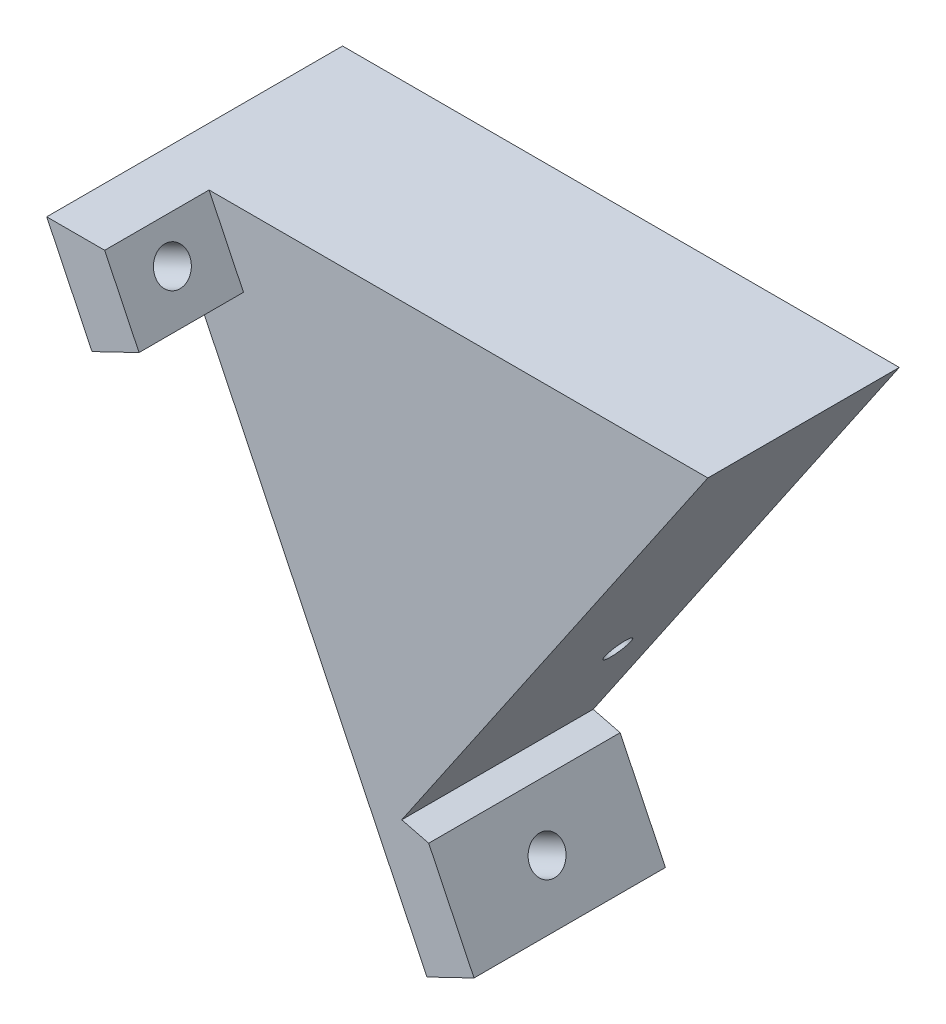
ISO-10303-21;
HEADER;
FILE_DESCRIPTION(('STEP AP214'),'2;1');
FILE_NAME('part.step','',(''),(''),'','','');
FILE_SCHEMA(('AUTOMOTIVE_DESIGN { 1 0 10303 214 1 1 1 1 }'));
ENDSEC;
DATA;
#1=APPLICATION_CONTEXT('core data for automotive mechanical design processes');
#2=APPLICATION_PROTOCOL_DEFINITION('international standard','automotive_design',2000,#1);
#3=PRODUCT_CONTEXT('',#1,'mechanical');
#4=PRODUCT('Part','Part','',(#3));
#5=PRODUCT_RELATED_PRODUCT_CATEGORY('part','',(#4));
#6=PRODUCT_DEFINITION_FORMATION('','',#4);
#7=PRODUCT_DEFINITION_CONTEXT('part definition',#1,'design');
#8=PRODUCT_DEFINITION('design','',#6,#7);
#9=PRODUCT_DEFINITION_SHAPE('','',#8);
#10=(LENGTH_UNIT() NAMED_UNIT(*) SI_UNIT(.MILLI.,.METRE.));
#11=(NAMED_UNIT(*) PLANE_ANGLE_UNIT() SI_UNIT($,.RADIAN.));
#12=(NAMED_UNIT(*) SI_UNIT($,.STERADIAN.) SOLID_ANGLE_UNIT());
#13=UNCERTAINTY_MEASURE_WITH_UNIT(LENGTH_MEASURE(1.E-05),#10,'distance_accuracy_value','');
#14=(GEOMETRIC_REPRESENTATION_CONTEXT(3) GLOBAL_UNCERTAINTY_ASSIGNED_CONTEXT((#13)) GLOBAL_UNIT_ASSIGNED_CONTEXT((#10,
#11,#12)) REPRESENTATION_CONTEXT('',''));
#15=CARTESIAN_POINT('',(0.,0.,0.));
#16=DIRECTION('',(0.,0.,1.));
#17=DIRECTION('',(1.,0.,0.));
#18=AXIS2_PLACEMENT_3D('',#15,#16,#17);
#19=CARTESIAN_POINT('',(0.,0.,22.));
#20=DIRECTION('',(0.,0.,1.));
#21=DIRECTION('',(1.,0.,0.));
#22=AXIS2_PLACEMENT_3D('',#19,#20,#21);
#23=PLANE('',#22);
#24=DIRECTION('',(-1.,0.,0.));
#25=VECTOR('',#24,1.);
#26=CARTESIAN_POINT('',(27.7445797660574,24.241346542851,22.));
#27=LINE('',#26,#25);
#28=CARTESIAN_POINT('',(27.7445797660574,24.241346542851,22.));
#29=VERTEX_POINT('',#28);
#30=CARTESIAN_POINT('',(-29.578701160511,24.241346542851,22.));
#31=VERTEX_POINT('',#30);
#32=EDGE_CURVE('E111',#29,#31,#27,.T.);
#33=ORIENTED_EDGE('',*,*,#32,.T.);
#34=DIRECTION('',(0.434007039127834,-0.900909479352665,0.));
#35=VECTOR('',#34,1.);
#36=CARTESIAN_POINT('',(-30.8331808679364,26.8453887776181,22.));
#37=LINE('',#36,#35);
#38=CARTESIAN_POINT('',(-25.6250963984024,16.0344750253861,22.));
#39=VERTEX_POINT('',#38);
#40=EDGE_CURVE('E117',#31,#39,#37,.T.);
#41=ORIENTED_EDGE('',*,*,#40,.T.);
#42=DIRECTION('',(-0.900909479352665,-0.434007039127834,0.));
#43=VECTOR('',#42,1.);
#44=CARTESIAN_POINT('',(-25.6250963984024,16.0344750253861,22.));
#45=LINE('',#44,#43);
#46=CARTESIAN_POINT('',(-31.0305532745184,13.4304327906191,22.));
#47=VERTEX_POINT('',#46);
#48=EDGE_CURVE('E137',#39,#47,#45,.T.);
#49=ORIENTED_EDGE('',*,*,#48,.T.);
#50=DIRECTION('',(0.434007039127834,-0.900909479352665,0.));
#51=VECTOR('',#50,1.);
#52=CARTESIAN_POINT('',(-36.2386377440524,24.241346542851,22.));
#53=LINE('',#52,#51);
#54=CARTESIAN_POINT('',(-4.53467583166741,-41.5695672093809,22.));
#55=VERTEX_POINT('',#54);
#56=EDGE_CURVE('E130',#47,#55,#53,.T.);
#57=ORIENTED_EDGE('',*,*,#56,.T.);
#58=DIRECTION('',(-0.900909479352665,-0.434007039127834,0.));
#59=VECTOR('',#58,1.);
#60=CARTESIAN_POINT('',(0.870781044448587,-38.9655249746139,22.));
#61=LINE('',#60,#59);
#62=CARTESIAN_POINT('',(0.870781044448587,-38.9655249746139,22.));
#63=VERTEX_POINT('',#62);
#64=EDGE_CURVE('E187',#63,#55,#61,.T.);
#65=ORIENTED_EDGE('',*,*,#64,.F.);
#66=DIRECTION('',(-0.434007039127834,0.900909479352665,0.));
#67=VECTOR('',#66,1.);
#68=CARTESIAN_POINT('',(-4.33730342508542,-28.154611222382,22.));
#69=LINE('',#68,#67);
#70=CARTESIAN_POINT('',(-4.33730342508542,-28.154611222382,22.));
#71=VERTEX_POINT('',#70);
#72=EDGE_CURVE('E181',#63,#71,#69,.T.);
#73=ORIENTED_EDGE('',*,*,#72,.T.);
#74=DIRECTION('',(0.969773253525637,-0.24400786205838,0.));
#75=VECTOR('',#74,1.);
#76=CARTESIAN_POINT('',(-4.33730342508542,-28.154611222382,22.));
#77=LINE('',#76,#75);
#78=CARTESIAN_POINT('',(-7.43639298756733,-27.3748390274699,22.));
#79=VERTEX_POINT('',#78);
#80=EDGE_CURVE('E193',#79,#71,#77,.T.);
#81=ORIENTED_EDGE('',*,*,#80,.F.);
#82=DIRECTION('',(0.563206976065699,0.826315860982307,0.));
#83=VECTOR('',#82,1.);
#84=CARTESIAN_POINT('',(-9.74276030120141,-30.758653457149,22.));
#85=LINE('',#84,#83);
#86=EDGE_CURVE('E128',#79,#29,#85,.T.);
#87=ORIENTED_EDGE('',*,*,#86,.T.);
#88=EDGE_LOOP('',(#33,#41,#49,#57,#65,#73,#81,#87));
#89=FACE_BOUND('',#88,.T.);
#90=ADVANCED_FACE('F33',(#89),#23,.T.);
#91=CARTESIAN_POINT('',(27.7445797660574,24.241346542851,22.));
#92=DIRECTION('',(0.,-1.,0.));
#93=DIRECTION('',(0.,0.,-1.));
#94=AXIS2_PLACEMENT_3D('',#91,#92,#93);
#95=PLANE('',#94);
#96=DIRECTION('',(-1.,0.,0.));
#97=VECTOR('',#96,1.);
#98=CARTESIAN_POINT('',(27.7445797660574,24.241346542851,0.));
#99=LINE('',#98,#97);
#100=CARTESIAN_POINT('',(27.7445797660574,24.241346542851,0.));
#101=VERTEX_POINT('',#100);
#102=CARTESIAN_POINT('',(-36.2386377440524,24.241346542851,0.));
#103=VERTEX_POINT('',#102);
#104=EDGE_CURVE('E142',#101,#103,#99,.T.);
#105=ORIENTED_EDGE('',*,*,#104,.T.);
#106=DIRECTION('',(0.,0.,-1.));
#107=VECTOR('',#106,1.);
#108=CARTESIAN_POINT('',(-36.2386377440524,24.241346542851,22.));
#109=LINE('',#108,#107);
#110=CARTESIAN_POINT('',(-36.2386377440524,24.241346542851,34.));
#111=VERTEX_POINT('',#110);
#112=EDGE_CURVE('E124',#111,#103,#109,.T.);
#113=ORIENTED_EDGE('',*,*,#112,.F.);
#114=DIRECTION('',(1.,0.,0.));
#115=VECTOR('',#114,1.);
#116=CARTESIAN_POINT('',(-30.8331808679364,24.241346542851,34.));
#117=LINE('',#116,#115);
#118=CARTESIAN_POINT('',(-29.578701160511,24.241346542851,34.));
#119=VERTEX_POINT('',#118);
#120=EDGE_CURVE('E47',#111,#119,#117,.T.);
#121=ORIENTED_EDGE('',*,*,#120,.T.);
#122=DIRECTION('',(0.,0.,-1.));
#123=VECTOR('',#122,1.);
#124=CARTESIAN_POINT('',(-29.578701160511,24.241346542851,0.));
#125=LINE('',#124,#123);
#126=EDGE_CURVE('E11',#119,#31,#125,.T.);
#127=ORIENTED_EDGE('',*,*,#126,.T.);
#128=ORIENTED_EDGE('',*,*,#32,.F.);
#129=DIRECTION('',(0.,0.,-1.));
#130=VECTOR('',#129,1.);
#131=CARTESIAN_POINT('',(27.7445797660574,24.241346542851,22.));
#132=LINE('',#131,#130);
#133=EDGE_CURVE('E141',#29,#101,#132,.T.);
#134=ORIENTED_EDGE('',*,*,#133,.T.);
#135=EDGE_LOOP('',(#105,#113,#121,#127,#128,#134));
#136=FACE_BOUND('',#135,.T.);
#137=ADVANCED_FACE('F35',(#136),#95,.F.);
#138=CARTESIAN_POINT('',(-36.2386377440524,24.241346542851,22.));
#139=DIRECTION('',(0.900909479352666,0.434007039127834,0.));
#140=DIRECTION('',(-0.434007039127834,0.900909479352666,0.));
#141=AXIS2_PLACEMENT_3D('',#138,#139,#140);
#142=PLANE('',#141);
#143=DIRECTION('',(0.,0.,-1.));
#144=VECTOR('',#143,1.);
#145=CARTESIAN_POINT('',(-27.7840941238881,6.69145033307294,22.));
#146=LINE('',#145,#144);
#147=CARTESIAN_POINT('',(-27.7840941238881,6.69145033307294,8.2837399816851));
#148=VERTEX_POINT('',#147);
#149=CARTESIAN_POINT('',(-27.7840941238881,6.69145033307294,5.7162600183149));
#150=VERTEX_POINT('',#149);
#151=EDGE_CURVE('E41',#148,#150,#146,.T.);
#152=ORIENTED_EDGE('',*,*,#151,.F.);
#153=CARTESIAN_POINT('',(-28.4575811287251,8.08947103821584,7.));
#154=DIRECTION('',(0.900909479352666,0.434007039127834,0.));
#155=DIRECTION('',(0.434007039127834,-0.900909479352666,0.));
#156=AXIS2_PLACEMENT_3D('',#153,#154,#155);
#157=ELLIPSE('',#156,2.99999999999998,1.5);
#158=EDGE_CURVE('E154',#148,#150,#157,.T.);
#159=ORIENTED_EDGE('',*,*,#158,.T.);
#160=EDGE_LOOP('',(#152,#159));
#161=FACE_BOUND('',#160,.T.);
#162=CARTESIAN_POINT('',(-33.2005884701575,17.9349801873824,28.));
#163=DIRECTION('',(0.900909479352665,0.434007039127834,0.));
#164=DIRECTION('',(-0.434007039127834,0.900909479352665,0.));
#165=AXIS2_PLACEMENT_3D('',#162,#163,#164);
#166=CIRCLE('',#165,2.);
#167=CARTESIAN_POINT('',(-34.0686025484132,19.7367991460877,28.));
#168=VERTEX_POINT('',#167);
#169=EDGE_CURVE('E166',#168,#168,#166,.T.);
#170=ORIENTED_EDGE('',*,*,#169,.T.);
#171=EDGE_LOOP('',(#170));
#172=FACE_BOUND('',#171,.T.);
#173=CARTESIAN_POINT('',(-7.13871806643441,-36.164110333265,11.));
#174=DIRECTION('',(0.900909479352665,0.434007039127834,0.));
#175=DIRECTION('',(-0.434007039127834,0.900909479352665,0.));
#176=AXIS2_PLACEMENT_3D('',#173,#174,#175);
#177=CIRCLE('',#176,2.);
#178=CARTESIAN_POINT('',(-8.00673214469008,-34.3622913745596,11.));
#179=VERTEX_POINT('',#178);
#180=EDGE_CURVE('E162',#179,#179,#177,.T.);
#181=ORIENTED_EDGE('',*,*,#180,.T.);
#182=EDGE_LOOP('',(#181));
#183=FACE_BOUND('',#182,.T.);
#184=DIRECTION('',(0.434007039127834,-0.900909479352665,0.));
#185=VECTOR('',#184,1.);
#186=CARTESIAN_POINT('',(-36.2386377440524,24.241346542851,0.));
#187=LINE('',#186,#185);
#188=CARTESIAN_POINT('',(-4.53467583166741,-41.5695672093809,0.));
#189=VERTEX_POINT('',#188);
#190=EDGE_CURVE('E134',#103,#189,#187,.T.);
#191=ORIENTED_EDGE('',*,*,#190,.T.);
#192=DIRECTION('',(0.,0.,1.));
#193=VECTOR('',#192,1.);
#194=CARTESIAN_POINT('',(-4.53467583166741,-41.5695672093809,0.));
#195=LINE('',#194,#193);
#196=EDGE_CURVE('E169',#189,#55,#195,.T.);
#197=ORIENTED_EDGE('',*,*,#196,.T.);
#198=ORIENTED_EDGE('',*,*,#56,.F.);
#199=DIRECTION('',(0.,0.,1.));
#200=VECTOR('',#199,1.);
#201=CARTESIAN_POINT('',(-31.0305532745184,13.4304327906191,34.));
#202=LINE('',#201,#200);
#203=CARTESIAN_POINT('',(-31.0305532745184,13.4304327906191,34.));
#204=VERTEX_POINT('',#203);
#205=EDGE_CURVE('E204',#47,#204,#202,.T.);
#206=ORIENTED_EDGE('',*,*,#205,.T.);
#207=DIRECTION('',(-0.434007039127834,0.900909479352665,0.));
#208=VECTOR('',#207,1.);
#209=CARTESIAN_POINT('',(-36.2386377440524,24.241346542851,34.));
#210=LINE('',#209,#208);
#211=EDGE_CURVE('E200',#204,#111,#210,.T.);
#212=ORIENTED_EDGE('',*,*,#211,.T.);
#213=ORIENTED_EDGE('',*,*,#112,.T.);
#214=EDGE_LOOP('',(#191,#197,#198,#206,#212,#213));
#215=FACE_BOUND('',#214,.T.);
#216=ADVANCED_FACE('F157',(#161,#172,#183,#215),#142,.F.);
#217=CARTESIAN_POINT('',(-9.74276030120141,-30.758653457149,22.));
#218=DIRECTION('',(-0.826315860982307,0.563206976065699,0.));
#219=DIRECTION('',(-0.563206976065699,-0.826315860982307,0.));
#220=AXIS2_PLACEMENT_3D('',#217,#218,#219);
#221=PLANE('',#220);
#222=CARTESIAN_POINT('',(2.40026584310091,-12.9428672013528,7.));
#223=DIRECTION('',(0.826315860982307,-0.563206976065699,0.));
#224=DIRECTION('',(0.563206976065699,0.826315860982307,0.));
#225=AXIS2_PLACEMENT_3D('',#222,#223,#224);
#226=CIRCLE('',#225,1.5);
#227=CARTESIAN_POINT('',(3.24507630719946,-11.7033934098793,7.));
#228=VERTEX_POINT('',#227);
#229=EDGE_CURVE('E155',#228,#228,#226,.T.);
#230=ORIENTED_EDGE('',*,*,#229,.F.);
#231=EDGE_LOOP('',(#230));
#232=FACE_BOUND('',#231,.T.);
#233=ORIENTED_EDGE('',*,*,#86,.F.);
#234=DIRECTION('',(0.,0.,-1.));
#235=VECTOR('',#234,1.);
#236=CARTESIAN_POINT('',(-7.43639298756733,-27.3748390274699,22.));
#237=LINE('',#236,#235);
#238=CARTESIAN_POINT('',(-7.43639298756733,-27.3748390274699,0.));
#239=VERTEX_POINT('',#238);
#240=EDGE_CURVE('E195',#79,#239,#237,.T.);
#241=ORIENTED_EDGE('',*,*,#240,.T.);
#242=DIRECTION('',(0.563206976065699,0.826315860982307,0.));
#243=VECTOR('',#242,1.);
#244=CARTESIAN_POINT('',(-9.74276030120141,-30.758653457149,0.));
#245=LINE('',#244,#243);
#246=EDGE_CURVE('E131',#239,#101,#245,.T.);
#247=ORIENTED_EDGE('',*,*,#246,.T.);
#248=ORIENTED_EDGE('',*,*,#133,.F.);
#249=EDGE_LOOP('',(#233,#241,#247,#248));
#250=FACE_BOUND('',#249,.T.);
#251=ADVANCED_FACE('F230',(#232,#250),#221,.F.);
#252=CARTESIAN_POINT('',(0.,0.,0.));
#253=DIRECTION('',(0.,0.,1.));
#254=DIRECTION('',(1.,0.,0.));
#255=AXIS2_PLACEMENT_3D('',#252,#253,#254);
#256=PLANE('',#255);
#257=ORIENTED_EDGE('',*,*,#104,.F.);
#258=ORIENTED_EDGE('',*,*,#246,.F.);
#259=DIRECTION('',(0.969773253525637,-0.24400786205838,0.));
#260=VECTOR('',#259,1.);
#261=CARTESIAN_POINT('',(-4.33730342508542,-28.154611222382,0.));
#262=LINE('',#261,#260);
#263=CARTESIAN_POINT('',(-4.33730342508542,-28.154611222382,0.));
#264=VERTEX_POINT('',#263);
#265=EDGE_CURVE('E190',#239,#264,#262,.T.);
#266=ORIENTED_EDGE('',*,*,#265,.T.);
#267=DIRECTION('',(0.434007039127834,-0.900909479352665,0.));
#268=VECTOR('',#267,1.);
#269=CARTESIAN_POINT('',(-4.33730342508542,-28.154611222382,0.));
#270=LINE('',#269,#268);
#271=CARTESIAN_POINT('',(0.870781044448587,-38.9655249746139,0.));
#272=VERTEX_POINT('',#271);
#273=EDGE_CURVE('E175',#264,#272,#270,.T.);
#274=ORIENTED_EDGE('',*,*,#273,.T.);
#275=DIRECTION('',(-0.900909479352665,-0.434007039127834,0.));
#276=VECTOR('',#275,1.);
#277=CARTESIAN_POINT('',(0.870781044448587,-38.9655249746139,0.));
#278=LINE('',#277,#276);
#279=EDGE_CURVE('E184',#272,#189,#278,.T.);
#280=ORIENTED_EDGE('',*,*,#279,.T.);
#281=ORIENTED_EDGE('',*,*,#190,.F.);
#282=EDGE_LOOP('',(#257,#258,#266,#274,#280,#281));
#283=FACE_BOUND('',#282,.T.);
#284=ADVANCED_FACE('F228',(#283),#256,.F.);
#285=CARTESIAN_POINT('',(-30.8331808679364,26.8453887776181,34.));
#286=DIRECTION('',(0.,0.,1.));
#287=DIRECTION('',(1.,0.,0.));
#288=AXIS2_PLACEMENT_3D('',#285,#286,#287);
#289=PLANE('',#288);
#290=ORIENTED_EDGE('',*,*,#120,.F.);
#291=ORIENTED_EDGE('',*,*,#211,.F.);
#292=DIRECTION('',(-0.900909479352665,-0.434007039127834,0.));
#293=VECTOR('',#292,1.);
#294=CARTESIAN_POINT('',(-25.6250963984024,16.0344750253861,34.));
#295=LINE('',#294,#293);
#296=CARTESIAN_POINT('',(-25.6250963984024,16.0344750253861,34.));
#297=VERTEX_POINT('',#296);
#298=EDGE_CURVE('E144',#297,#204,#295,.T.);
#299=ORIENTED_EDGE('',*,*,#298,.F.);
#300=DIRECTION('',(-0.434007039127834,0.900909479352665,0.));
#301=VECTOR('',#300,1.);
#302=CARTESIAN_POINT('',(-30.8331808679364,26.8453887776181,34.));
#303=LINE('',#302,#301);
#304=EDGE_CURVE('E203',#297,#119,#303,.T.);
#305=ORIENTED_EDGE('',*,*,#304,.T.);
#306=EDGE_LOOP('',(#290,#291,#299,#305));
#307=FACE_BOUND('',#306,.T.);
#308=ADVANCED_FACE('F232',(#307),#289,.T.);
#309=CARTESIAN_POINT('',(-25.6250963984024,16.0344750253861,34.));
#310=DIRECTION('',(0.434007039127834,-0.900909479352665,0.));
#311=DIRECTION('',(0.900909479352665,0.434007039127834,0.));
#312=AXIS2_PLACEMENT_3D('',#309,#310,#311);
#313=PLANE('',#312);
#314=ORIENTED_EDGE('',*,*,#205,.F.);
#315=ORIENTED_EDGE('',*,*,#48,.F.);
#316=DIRECTION('',(0.,0.,1.));
#317=VECTOR('',#316,1.);
#318=CARTESIAN_POINT('',(-25.6250963984024,16.0344750253861,34.));
#319=LINE('',#318,#317);
#320=EDGE_CURVE('E121',#39,#297,#319,.T.);
#321=ORIENTED_EDGE('',*,*,#320,.T.);
#322=ORIENTED_EDGE('',*,*,#298,.T.);
#323=EDGE_LOOP('',(#314,#315,#321,#322));
#324=FACE_BOUND('',#323,.T.);
#325=ADVANCED_FACE('F253',(#324),#313,.T.);
#326=CARTESIAN_POINT('',(-14.5288025097088,-6.99915219433874,0.));
#327=DIRECTION('',(0.900909479352665,0.434007039127834,0.));
#328=DIRECTION('',(-0.434007039127834,0.900909479352665,0.));
#329=AXIS2_PLACEMENT_3D('',#326,#327,#328);
#330=PLANE('',#329);
#331=ORIENTED_EDGE('',*,*,#126,.F.);
#332=ORIENTED_EDGE('',*,*,#304,.F.);
#333=ORIENTED_EDGE('',*,*,#320,.F.);
#334=ORIENTED_EDGE('',*,*,#40,.F.);
#335=EDGE_LOOP('',(#331,#332,#333,#334));
#336=FACE_BOUND('',#335,.T.);
#337=CARTESIAN_POINT('',(-27.7951315940415,20.5390224221494,28.));
#338=DIRECTION('',(0.900909479352665,0.434007039127834,0.));
#339=DIRECTION('',(-0.434007039127834,0.900909479352665,0.));
#340=AXIS2_PLACEMENT_3D('',#337,#338,#339);
#341=CIRCLE('',#340,2.);
#342=CARTESIAN_POINT('',(-28.6631456722972,22.3408413808547,28.));
#343=VERTEX_POINT('',#342);
#344=EDGE_CURVE('E170',#343,#343,#341,.T.);
#345=ORIENTED_EDGE('',*,*,#344,.F.);
#346=EDGE_LOOP('',(#345));
#347=FACE_BOUND('',#346,.T.);
#348=ADVANCED_FACE('F118',(#336,#347),#330,.T.);
#349=CARTESIAN_POINT('',(-4.33730342508542,-28.154611222382,22.));
#350=DIRECTION('',(0.24400786205838,0.969773253525637,0.));
#351=DIRECTION('',(-0.969773253525637,0.24400786205838,0.));
#352=AXIS2_PLACEMENT_3D('',#349,#350,#351);
#353=PLANE('',#352);
#354=ORIENTED_EDGE('',*,*,#265,.F.);
#355=ORIENTED_EDGE('',*,*,#240,.F.);
#356=ORIENTED_EDGE('',*,*,#80,.T.);
#357=DIRECTION('',(0.,0.,-1.));
#358=VECTOR('',#357,1.);
#359=CARTESIAN_POINT('',(-4.33730342508542,-28.154611222382,22.));
#360=LINE('',#359,#358);
#361=EDGE_CURVE('E198',#71,#264,#360,.T.);
#362=ORIENTED_EDGE('',*,*,#361,.T.);
#363=EDGE_LOOP('',(#354,#355,#356,#362));
#364=FACE_BOUND('',#363,.T.);
#365=ADVANCED_FACE('F224',(#364),#353,.T.);
#366=CARTESIAN_POINT('',(0.870781044448587,-38.9655249746139,0.));
#367=DIRECTION('',(0.434007039127834,-0.900909479352665,0.));
#368=DIRECTION('',(0.900909479352665,0.434007039127834,0.));
#369=AXIS2_PLACEMENT_3D('',#366,#367,#368);
#370=PLANE('',#369);
#371=ORIENTED_EDGE('',*,*,#196,.F.);
#372=ORIENTED_EDGE('',*,*,#279,.F.);
#373=DIRECTION('',(0.,0.,1.));
#374=VECTOR('',#373,1.);
#375=CARTESIAN_POINT('',(0.870781044448587,-38.9655249746139,0.));
#376=LINE('',#375,#374);
#377=EDGE_CURVE('E178',#272,#63,#376,.T.);
#378=ORIENTED_EDGE('',*,*,#377,.T.);
#379=ORIENTED_EDGE('',*,*,#64,.T.);
#380=EDGE_LOOP('',(#371,#372,#378,#379));
#381=FACE_BOUND('',#380,.T.);
#382=ADVANCED_FACE('F216',(#381),#370,.T.);
#383=CARTESIAN_POINT('',(-14.5288025097088,-6.99915219433874,0.));
#384=DIRECTION('',(-0.900909479352665,-0.434007039127834,0.));
#385=DIRECTION('',(0.434007039127834,-0.900909479352665,0.));
#386=AXIS2_PLACEMENT_3D('',#383,#384,#385);
#387=PLANE('',#386);
#388=CARTESIAN_POINT('',(-1.73326119031842,-33.560068098498,11.));
#389=DIRECTION('',(0.900909479352665,0.434007039127834,0.));
#390=DIRECTION('',(-0.434007039127834,0.900909479352665,0.));
#391=AXIS2_PLACEMENT_3D('',#388,#389,#390);
#392=CIRCLE('',#391,2.);
#393=CARTESIAN_POINT('',(-2.60127526857409,-31.7582491397926,11.));
#394=VERTEX_POINT('',#393);
#395=EDGE_CURVE('E159',#394,#394,#392,.T.);
#396=ORIENTED_EDGE('',*,*,#395,.F.);
#397=EDGE_LOOP('',(#396));
#398=FACE_BOUND('',#397,.T.);
#399=ORIENTED_EDGE('',*,*,#273,.F.);
#400=ORIENTED_EDGE('',*,*,#361,.F.);
#401=ORIENTED_EDGE('',*,*,#72,.F.);
#402=ORIENTED_EDGE('',*,*,#377,.F.);
#403=EDGE_LOOP('',(#399,#400,#401,#402));
#404=FACE_BOUND('',#403,.T.);
#405=ADVANCED_FACE('F222',(#398,#404),#387,.F.);
#406=CARTESIAN_POINT('',(-7.13871806643441,-36.164110333265,11.));
#407=DIRECTION('',(0.900909479352665,0.434007039127834,0.));
#408=DIRECTION('',(-0.434007039127834,0.900909479352665,0.));
#409=AXIS2_PLACEMENT_3D('',#406,#407,#408);
#410=CYLINDRICAL_SURFACE('',#409,2.);
#411=CARTESIAN_POINT('',(-8.00673214469008,-34.3622913745596,11.));
#412=CARTESIAN_POINT('',(-7.95042530223054,-34.3351659346141,11.));
#413=CARTESIAN_POINT('',(-7.894118459771,-34.3080404946686,11.));
#414=CARTESIAN_POINT('',(-7.78150477485191,-34.2537896147777,11.));
#415=CARTESIAN_POINT('',(-7.72519793239237,-34.2266641748322,11.));
#416=CARTESIAN_POINT('',(-7.61258424747329,-34.1724132949412,11.));
#417=CARTESIAN_POINT('',(-7.55627740501375,-34.1452878549957,11.));
#418=CARTESIAN_POINT('',(-7.44366372009467,-34.0910369751047,11.));
#419=CARTESIAN_POINT('',(-7.38735687763512,-34.0639115351592,11.));
#420=CARTESIAN_POINT('',(-7.27474319271604,-34.0096606552683,11.));
#421=CARTESIAN_POINT('',(-7.2184363502565,-33.9825352153228,11.));
#422=CARTESIAN_POINT('',(-7.10582266533742,-33.9282843354318,11.));
#423=CARTESIAN_POINT('',(-7.04951582287787,-33.9011588954863,11.));
#424=CARTESIAN_POINT('',(-6.93690213795879,-33.8469080155953,11.));
#425=CARTESIAN_POINT('',(-6.88059529549925,-33.8197825756498,11.));
#426=CARTESIAN_POINT('',(-6.76798161058017,-33.7655316957588,11.));
#427=CARTESIAN_POINT('',(-6.71167476812063,-33.7384062558134,11.));
#428=CARTESIAN_POINT('',(-6.59906108320154,-33.6841553759224,11.));
#429=CARTESIAN_POINT('',(-6.542754240742,-33.6570299359769,11.));
#430=CARTESIAN_POINT('',(-6.43014055582292,-33.6027790560859,11.));
#431=CARTESIAN_POINT('',(-6.37383371336337,-33.5756536161404,11.));
#432=CARTESIAN_POINT('',(-6.26122002844429,-33.5214027362494,11.));
#433=CARTESIAN_POINT('',(-6.20491318598475,-33.4942772963039,11.));
#434=CARTESIAN_POINT('',(-6.09229950106567,-33.440026416413,11.));
#435=CARTESIAN_POINT('',(-6.03599265860613,-33.4129009764675,11.));
#436=CARTESIAN_POINT('',(-5.92337897368704,-33.3586500965765,11.));
#437=CARTESIAN_POINT('',(-5.8670721312275,-33.331524656631,11.));
#438=CARTESIAN_POINT('',(-5.75445844630842,-33.27727377674,11.));
#439=CARTESIAN_POINT('',(-5.69815160384888,-33.2501483367946,11.));
#440=CARTESIAN_POINT('',(-5.58553791892979,-33.1958974569036,11.));
#441=CARTESIAN_POINT('',(-5.52923107647025,-33.1687720169581,11.));
#442=CARTESIAN_POINT('',(-5.41661739155117,-33.1145211370671,11.));
#443=CARTESIAN_POINT('',(-5.36031054909163,-33.0873956971216,11.));
#444=CARTESIAN_POINT('',(-5.24769686417254,-33.0331448172306,11.));
#445=CARTESIAN_POINT('',(-5.191390021713,-33.0060193772851,11.));
#446=CARTESIAN_POINT('',(-5.07877633679392,-32.9517684973942,11.));
#447=CARTESIAN_POINT('',(-5.02246949433438,-32.9246430574487,11.));
#448=CARTESIAN_POINT('',(-4.90985580941529,-32.8703921775577,11.));
#449=CARTESIAN_POINT('',(-4.85354896695575,-32.8432667376122,11.));
#450=CARTESIAN_POINT('',(-4.74093528203667,-32.7890158577212,11.));
#451=CARTESIAN_POINT('',(-4.68462843957713,-32.7618904177757,11.));
#452=CARTESIAN_POINT('',(-4.57201475465804,-32.7076395378848,11.));
#453=CARTESIAN_POINT('',(-4.5157079121985,-32.6805140979393,11.));
#454=CARTESIAN_POINT('',(-4.40309422727942,-32.6262632180483,11.));
#455=CARTESIAN_POINT('',(-4.34678738481988,-32.5991377781028,11.));
#456=CARTESIAN_POINT('',(-4.2341736999008,-32.5448868982118,11.));
#457=CARTESIAN_POINT('',(-4.17786685744125,-32.5177614582663,11.));
#458=CARTESIAN_POINT('',(-4.06525317252217,-32.4635105783753,11.));
#459=CARTESIAN_POINT('',(-4.00894633006263,-32.4363851384299,11.));
#460=CARTESIAN_POINT('',(-3.89633264514355,-32.3821342585389,11.));
#461=CARTESIAN_POINT('',(-3.840025802684,-32.3550088185934,11.));
#462=CARTESIAN_POINT('',(-3.72741211776492,-32.3007579387024,11.));
#463=CARTESIAN_POINT('',(-3.67110527530538,-32.2736324987569,11.));
#464=CARTESIAN_POINT('',(-3.5584915903863,-32.2193816188659,11.));
#465=CARTESIAN_POINT('',(-3.50218474792675,-32.1922561789205,11.));
#466=CARTESIAN_POINT('',(-3.38957106300767,-32.1380052990295,11.));
#467=CARTESIAN_POINT('',(-3.33326422054813,-32.110879859084,11.));
#468=CARTESIAN_POINT('',(-3.22065053562905,-32.056628979193,11.));
#469=CARTESIAN_POINT('',(-3.1643436931695,-32.0295035392475,11.));
#470=CARTESIAN_POINT('',(-3.05173000825042,-31.9752526593565,11.));
#471=CARTESIAN_POINT('',(-2.99542316579088,-31.948127219411,11.));
#472=CARTESIAN_POINT('',(-2.8828094808718,-31.8938763395201,11.));
#473=CARTESIAN_POINT('',(-2.82650263841226,-31.8667508995746,11.));
#474=CARTESIAN_POINT('',(-2.71388895349317,-31.8125000196836,11.));
#475=CARTESIAN_POINT('',(-2.65758211103363,-31.7853745797381,11.));
#476=CARTESIAN_POINT('',(-2.60127526857409,-31.7582491397926,11.));
#477=B_SPLINE_CURVE_WITH_KNOTS('',3,(#411,#412,#413,#414,#415,#416,#417,#418,#419,#420,#421,
#422,#423,#424,#425,#426,#427,#428,#429,#430,#431,#432,#433,#434,#435,#436,#437,#438,#439,#440,
#441,#442,#443,#444,#445,#446,#447,#448,#449,#450,#451,#452,#453,#454,#455,#456,#457,#458,#459,
#460,#461,#462,#463,#464,#465,#466,#467,#468,#469,#470,#471,#472,#473,#474,#475,#476),
.UNSPECIFIED.,.F.,.F.,(4,2,2,2,2,2,2,2,2,2,2,2,2,2,2,2,2,2,2,2,2,2,2,2,2,2,2,2,2,2,2,2,4),(0.,
0.187500000000002,0.374999999999999,0.5625,0.750000000000002,0.937499999999999,1.125,1.3125,1.5,
1.6875,1.875,2.0625,2.25,2.4375,2.625,2.8125,3.,3.1875,3.375,3.5625,3.75,3.9375,4.125,4.3125,
4.5,4.6875,4.875,5.0625,5.25,5.4375,5.625,5.8125,6.),.UNSPECIFIED.);
#478=EDGE_CURVE('BSEAM264',#179,#394,#477,.T.);
#479=ORIENTED_EDGE('',*,*,#180,.F.);
#480=ORIENTED_EDGE('',*,*,#395,.T.);
#481=ORIENTED_EDGE('',*,*,#478,.T.);
#482=ORIENTED_EDGE('',*,*,#478,.F.);
#483=EDGE_LOOP('',(#479,#481,#480,#482));
#484=FACE_BOUND('',#483,.T.);
#485=ADVANCED_FACE('F264',(#484),#410,.F.);
#486=CARTESIAN_POINT('',(-33.2005884701575,17.9349801873824,28.));
#487=DIRECTION('',(0.900909479352665,0.434007039127834,0.));
#488=DIRECTION('',(-0.434007039127834,0.900909479352665,0.));
#489=AXIS2_PLACEMENT_3D('',#486,#487,#488);
#490=CYLINDRICAL_SURFACE('',#489,2.);
#491=CARTESIAN_POINT('',(-34.0686025484132,19.7367991460877,28.));
#492=CARTESIAN_POINT('',(-34.0122957059537,19.7639245860332,28.));
#493=CARTESIAN_POINT('',(-33.9559888634941,19.7910500259787,28.));
#494=CARTESIAN_POINT('',(-33.843375178575,19.8453009058697,28.));
#495=CARTESIAN_POINT('',(-33.7870683361155,19.8724263458152,28.));
#496=CARTESIAN_POINT('',(-33.6744546511964,19.9266772257061,28.));
#497=CARTESIAN_POINT('',(-33.6181478087369,19.9538026656516,28.));
#498=CARTESIAN_POINT('',(-33.5055341238178,20.0080535455426,28.));
#499=CARTESIAN_POINT('',(-33.4492272813583,20.0351789854881,28.));
#500=CARTESIAN_POINT('',(-33.3366135964392,20.0894298653791,28.));
#501=CARTESIAN_POINT('',(-33.2803067539796,20.1165553053246,28.));
#502=CARTESIAN_POINT('',(-33.1676930690605,20.1708061852156,28.));
#503=CARTESIAN_POINT('',(-33.111386226601,20.197931625161,28.));
#504=CARTESIAN_POINT('',(-32.9987725416819,20.252182505052,28.));
#505=CARTESIAN_POINT('',(-32.9424656992224,20.2793079449975,28.));
#506=CARTESIAN_POINT('',(-32.8298520143033,20.3335588248885,28.));
#507=CARTESIAN_POINT('',(-32.7735451718438,20.360684264834,28.));
#508=CARTESIAN_POINT('',(-32.6609314869247,20.414935144725,28.));
#509=CARTESIAN_POINT('',(-32.6046246444651,20.4420605846705,28.));
#510=CARTESIAN_POINT('',(-32.4920109595461,20.4963114645614,28.));
#511=CARTESIAN_POINT('',(-32.4357041170865,20.5234369045069,28.));
#512=CARTESIAN_POINT('',(-32.3230904321674,20.5776877843979,28.));
#513=CARTESIAN_POINT('',(-32.2667835897079,20.6048132243434,28.));
#514=CARTESIAN_POINT('',(-32.1541699047888,20.6590641042344,28.));
#515=CARTESIAN_POINT('',(-32.0978630623293,20.6861895441799,28.));
#516=CARTESIAN_POINT('',(-31.9852493774102,20.7404404240708,28.));
#517=CARTESIAN_POINT('',(-31.9289425349506,20.7675658640163,28.));
#518=CARTESIAN_POINT('',(-31.8163288500315,20.8218167439073,28.));
#519=CARTESIAN_POINT('',(-31.760022007572,20.8489421838528,28.));
#520=CARTESIAN_POINT('',(-31.6474083226529,20.9031930637438,28.));
#521=CARTESIAN_POINT('',(-31.5911014801934,20.9303185036893,28.));
#522=CARTESIAN_POINT('',(-31.4784877952743,20.9845693835802,28.));
#523=CARTESIAN_POINT('',(-31.4221809528148,21.0116948235257,28.));
#524=CARTESIAN_POINT('',(-31.3095672678957,21.0659457034167,28.));
#525=CARTESIAN_POINT('',(-31.2532604254361,21.0930711433622,28.));
#526=CARTESIAN_POINT('',(-31.140646740517,21.1473220232532,28.));
#527=CARTESIAN_POINT('',(-31.0843398980575,21.1744474631987,28.));
#528=CARTESIAN_POINT('',(-30.9717262131384,21.2286983430896,28.));
#529=CARTESIAN_POINT('',(-30.9154193706789,21.2558237830351,28.));
#530=CARTESIAN_POINT('',(-30.8028056857598,21.3100746629261,28.));
#531=CARTESIAN_POINT('',(-30.7464988433003,21.3372001028716,28.));
#532=CARTESIAN_POINT('',(-30.6338851583812,21.3914509827626,28.));
#533=CARTESIAN_POINT('',(-30.5775783159216,21.4185764227081,28.));
#534=CARTESIAN_POINT('',(-30.4649646310025,21.4728273025991,28.));
#535=CARTESIAN_POINT('',(-30.408657788543,21.4999527425445,28.));
#536=CARTESIAN_POINT('',(-30.2960441036239,21.5542036224355,28.));
#537=CARTESIAN_POINT('',(-30.2397372611644,21.581329062381,28.));
#538=CARTESIAN_POINT('',(-30.1271235762453,21.635579942272,28.));
#539=CARTESIAN_POINT('',(-30.0708167337858,21.6627053822175,28.));
#540=CARTESIAN_POINT('',(-29.9582030488667,21.7169562621085,28.));
#541=CARTESIAN_POINT('',(-29.9018962064071,21.744081702054,28.));
#542=CARTESIAN_POINT('',(-29.7892825214881,21.7983325819449,28.));
#543=CARTESIAN_POINT('',(-29.7329756790285,21.8254580218904,28.));
#544=CARTESIAN_POINT('',(-29.6203619941094,21.8797089017814,28.));
#545=CARTESIAN_POINT('',(-29.5640551516499,21.9068343417269,28.));
#546=CARTESIAN_POINT('',(-29.4514414667308,21.9610852216179,28.));
#547=CARTESIAN_POINT('',(-29.3951346242713,21.9882106615634,28.));
#548=CARTESIAN_POINT('',(-29.2825209393522,22.0424615414543,28.));
#549=CARTESIAN_POINT('',(-29.2262140968926,22.0695869813998,28.));
#550=CARTESIAN_POINT('',(-29.1136004119736,22.1238378612908,28.));
#551=CARTESIAN_POINT('',(-29.057293569514,22.1509633012363,28.));
#552=CARTESIAN_POINT('',(-28.9446798845949,22.2052141811273,28.));
#553=CARTESIAN_POINT('',(-28.8883730421354,22.2323396210728,28.));
#554=CARTESIAN_POINT('',(-28.7757593572163,22.2865905009637,28.));
#555=CARTESIAN_POINT('',(-28.7194525147568,22.3137159409092,28.));
#556=CARTESIAN_POINT('',(-28.6631456722972,22.3408413808547,28.));
#557=B_SPLINE_CURVE_WITH_KNOTS('',3,(#491,#492,#493,#494,#495,#496,#497,#498,#499,#500,#501,
#502,#503,#504,#505,#506,#507,#508,#509,#510,#511,#512,#513,#514,#515,#516,#517,#518,#519,#520,
#521,#522,#523,#524,#525,#526,#527,#528,#529,#530,#531,#532,#533,#534,#535,#536,#537,#538,#539,
#540,#541,#542,#543,#544,#545,#546,#547,#548,#549,#550,#551,#552,#553,#554,#555,#556),
.UNSPECIFIED.,.F.,.F.,(4,2,2,2,2,2,2,2,2,2,2,2,2,2,2,2,2,2,2,2,2,2,2,2,2,2,2,2,2,2,2,2,4),(0.,
0.187500000000005,0.375000000000003,0.562500000000002,0.750000000000006,0.937500000000005,1.125,
1.3125,1.50000000000001,1.6875,1.875,2.0625,2.25000000000001,2.4375,2.625,2.8125,
3.00000000000001,3.1875,3.375,3.5625,3.75,3.9375,4.125,4.3125,4.5,4.6875,4.875,5.0625,5.25,
5.4375,5.625,5.8125,6.),.UNSPECIFIED.);
#558=EDGE_CURVE('BSEAM268',#168,#343,#557,.T.);
#559=ORIENTED_EDGE('',*,*,#169,.F.);
#560=ORIENTED_EDGE('',*,*,#344,.T.);
#561=ORIENTED_EDGE('',*,*,#558,.T.);
#562=ORIENTED_EDGE('',*,*,#558,.F.);
#563=EDGE_LOOP('',(#559,#561,#560,#562));
#564=FACE_BOUND('',#563,.T.);
#565=ADVANCED_FACE('F268',(#564),#490,.F.);
#566=CARTESIAN_POINT('',(-27.3471051522621,7.33258393701243,7.));
#567=DIRECTION('',(0.826315860982307,-0.563206976065699,0.));
#568=DIRECTION('',(0.563206976065699,0.826315860982307,0.));
#569=AXIS2_PLACEMENT_3D('',#566,#567,#568);
#570=PLANE('',#569);
#571=ORIENTED_EDGE('',*,*,#151,.T.);
#572=CARTESIAN_POINT('',(-27.3471051522621,7.33258393701243,7.));
#573=DIRECTION('',(0.826315860982307,-0.563206976065699,0.));
#574=DIRECTION('',(0.563206976065699,0.826315860982307,0.));
#575=AXIS2_PLACEMENT_3D('',#572,#573,#574);
#576=CIRCLE('',#575,1.5);
#577=EDGE_CURVE('E54',#150,#148,#576,.T.);
#578=ORIENTED_EDGE('',*,*,#577,.T.);
#579=EDGE_LOOP('',(#571,#578));
#580=FACE_BOUND('',#579,.T.);
#581=ADVANCED_FACE('F149',(#580),#570,.T.);
#582=CARTESIAN_POINT('',(-27.3471051522621,7.33258393701243,7.));
#583=DIRECTION('',(0.826315860982307,-0.563206976065699,0.));
#584=DIRECTION('',(0.563206976065699,0.826315860982307,0.));
#585=AXIS2_PLACEMENT_3D('',#582,#583,#584);
#586=CYLINDRICAL_SURFACE('',#585,1.5);
#587=ORIENTED_EDGE('',*,*,#229,.T.);
#588=EDGE_LOOP('',(#587));
#589=FACE_BOUND('',#588,.T.);
#590=ORIENTED_EDGE('',*,*,#577,.F.);
#591=ORIENTED_EDGE('',*,*,#158,.F.);
#592=EDGE_LOOP('',(#590,#591));
#593=FACE_BOUND('',#592,.T.);
#594=ADVANCED_FACE('F153',(#589,#593),#586,.F.);
#595=CLOSED_SHELL('',(#90,#137,#216,#251,#284,#308,#325,#348,#365,#382,#405,#485,#565,#581,#594));
#596=MANIFOLD_SOLID_BREP('B2',#595);
#597=ADVANCED_BREP_SHAPE_REPRESENTATION('',(#18,#596),#14);
#598=SHAPE_DEFINITION_REPRESENTATION(#9,#597);
ENDSEC;
END-ISO-10303-21;
